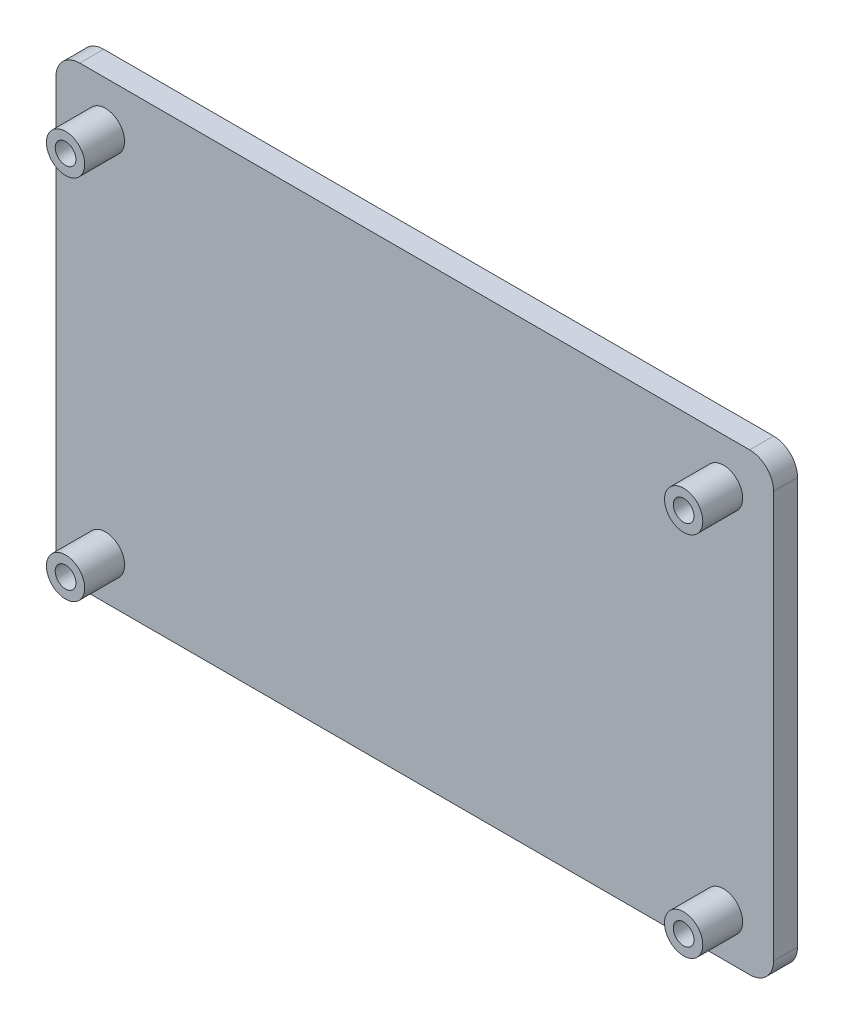
ISO-10303-21;
HEADER;
FILE_DESCRIPTION(('STEP AP214'),'2;1');
FILE_NAME('part.step','',(''),(''),'','','');
FILE_SCHEMA(('AUTOMOTIVE_DESIGN { 1 0 10303 214 1 1 1 1 }'));
ENDSEC;
DATA;
#1=APPLICATION_CONTEXT('core data for automotive mechanical design processes');
#2=APPLICATION_PROTOCOL_DEFINITION('international standard','automotive_design',2000,#1);
#3=PRODUCT_CONTEXT('',#1,'mechanical');
#4=PRODUCT('Part','Part','',(#3));
#5=PRODUCT_RELATED_PRODUCT_CATEGORY('part','',(#4));
#6=PRODUCT_DEFINITION_FORMATION('','',#4);
#7=PRODUCT_DEFINITION_CONTEXT('part definition',#1,'design');
#8=PRODUCT_DEFINITION('design','',#6,#7);
#9=PRODUCT_DEFINITION_SHAPE('','',#8);
#10=(LENGTH_UNIT() NAMED_UNIT(*) SI_UNIT(.MILLI.,.METRE.));
#11=(NAMED_UNIT(*) PLANE_ANGLE_UNIT() SI_UNIT($,.RADIAN.));
#12=(NAMED_UNIT(*) SI_UNIT($,.STERADIAN.) SOLID_ANGLE_UNIT());
#13=UNCERTAINTY_MEASURE_WITH_UNIT(LENGTH_MEASURE(1.E-05),#10,'distance_accuracy_value','');
#14=(GEOMETRIC_REPRESENTATION_CONTEXT(3) GLOBAL_UNCERTAINTY_ASSIGNED_CONTEXT((#13)) GLOBAL_UNIT_ASSIGNED_CONTEXT((#10,
#11,#12)) REPRESENTATION_CONTEXT('',''));
#15=CARTESIAN_POINT('',(0.,0.,0.));
#16=DIRECTION('',(0.,0.,1.));
#17=DIRECTION('',(1.,0.,0.));
#18=AXIS2_PLACEMENT_3D('',#15,#16,#17);
#19=CARTESIAN_POINT('',(0.,0.,0.));
#20=DIRECTION('',(0.,0.,1.));
#21=DIRECTION('',(1.,0.,0.));
#22=AXIS2_PLACEMENT_3D('',#19,#20,#21);
#23=PLANE('',#22);
#24=CARTESIAN_POINT('',(-43.7178545582846,-24.2969318414095,0.));
#25=DIRECTION('',(0.,0.,1.));
#26=DIRECTION('',(1.,0.,0.));
#27=AXIS2_PLACEMENT_3D('',#24,#25,#26);
#28=CIRCLE('',#27,3.);
#29=CARTESIAN_POINT('',(-43.7178545582846,-27.2969318414095,0.));
#30=VERTEX_POINT('',#29);
#31=CARTESIAN_POINT('',(-46.7178545582846,-24.2969318414095,0.));
#32=VERTEX_POINT('',#31);
#33=EDGE_CURVE('E395',#30,#32,#28,.F.);
#34=ORIENTED_EDGE('',*,*,#33,.F.);
#35=DIRECTION('',(1.,0.,0.));
#36=VECTOR('',#35,1.);
#37=CARTESIAN_POINT('',(0.,-27.2969318414095,0.));
#38=LINE('',#37,#36);
#39=CARTESIAN_POINT('',(40.2821454417154,-27.2969318414095,0.));
#40=VERTEX_POINT('',#39);
#41=EDGE_CURVE('E398',#30,#40,#38,.T.);
#42=ORIENTED_EDGE('',*,*,#41,.T.);
#43=CARTESIAN_POINT('',(40.2821454417154,-24.2969318414095,0.));
#44=DIRECTION('',(0.,0.,1.));
#45=DIRECTION('',(1.,0.,0.));
#46=AXIS2_PLACEMENT_3D('',#43,#44,#45);
#47=CIRCLE('',#46,3.);
#48=CARTESIAN_POINT('',(43.2821454417154,-24.2969318414095,0.));
#49=VERTEX_POINT('',#48);
#50=EDGE_CURVE('E403',#49,#40,#47,.F.);
#51=ORIENTED_EDGE('',*,*,#50,.F.);
#52=DIRECTION('',(0.,-1.,0.));
#53=VECTOR('',#52,1.);
#54=CARTESIAN_POINT('',(43.2821454417154,0.,0.));
#55=LINE('',#54,#53);
#56=CARTESIAN_POINT('',(43.2821454417154,26.7030681585905,0.));
#57=VERTEX_POINT('',#56);
#58=EDGE_CURVE('E407',#57,#49,#55,.T.);
#59=ORIENTED_EDGE('',*,*,#58,.F.);
#60=CARTESIAN_POINT('',(40.2821454417154,26.7030681585905,0.));
#61=DIRECTION('',(0.,0.,1.));
#62=DIRECTION('',(1.,0.,0.));
#63=AXIS2_PLACEMENT_3D('',#60,#61,#62);
#64=CIRCLE('',#63,3.00000000000001);
#65=CARTESIAN_POINT('',(40.2821454417154,29.7030681585905,0.));
#66=VERTEX_POINT('',#65);
#67=EDGE_CURVE('E410',#57,#66,#64,.T.);
#68=ORIENTED_EDGE('',*,*,#67,.T.);
#69=DIRECTION('',(1.,0.,0.));
#70=VECTOR('',#69,1.);
#71=CARTESIAN_POINT('',(0.,29.7030681585905,0.));
#72=LINE('',#71,#70);
#73=CARTESIAN_POINT('',(-43.7178545582846,29.7030681585905,0.));
#74=VERTEX_POINT('',#73);
#75=EDGE_CURVE('E414',#74,#66,#72,.T.);
#76=ORIENTED_EDGE('',*,*,#75,.F.);
#77=CARTESIAN_POINT('',(-43.7178545582846,26.7030681585905,0.));
#78=DIRECTION('',(0.,0.,1.));
#79=DIRECTION('',(1.,0.,0.));
#80=AXIS2_PLACEMENT_3D('',#77,#78,#79);
#81=CIRCLE('',#80,3.);
#82=CARTESIAN_POINT('',(-46.7178545582846,26.7030681585905,0.));
#83=VERTEX_POINT('',#82);
#84=EDGE_CURVE('E376',#83,#74,#81,.F.);
#85=ORIENTED_EDGE('',*,*,#84,.F.);
#86=DIRECTION('',(0.,-1.,0.));
#87=VECTOR('',#86,1.);
#88=CARTESIAN_POINT('',(-46.7178545582846,0.,0.));
#89=LINE('',#88,#87);
#90=EDGE_CURVE('E419',#83,#32,#89,.T.);
#91=ORIENTED_EDGE('',*,*,#90,.T.);
#92=EDGE_LOOP('',(#34,#42,#51,#59,#68,#76,#85,#91));
#93=FACE_BOUND('',#92,.T.);
#94=CARTESIAN_POINT('',(-40.5,24.,0.));
#95=DIRECTION('',(0.,0.,1.));
#96=DIRECTION('',(1.,0.,0.));
#97=AXIS2_PLACEMENT_3D('',#94,#95,#96);
#98=CIRCLE('',#97,2.4);
#99=CARTESIAN_POINT('',(-38.1,24.,0.));
#100=VERTEX_POINT('',#99);
#101=EDGE_CURVE('E291',#100,#100,#98,.T.);
#102=ORIENTED_EDGE('',*,*,#101,.F.);
#103=EDGE_LOOP('',(#102));
#104=FACE_BOUND('',#103,.T.);
#105=CARTESIAN_POINT('',(37.,24.,0.));
#106=DIRECTION('',(0.,0.,1.));
#107=DIRECTION('',(1.,0.,0.));
#108=AXIS2_PLACEMENT_3D('',#105,#106,#107);
#109=CIRCLE('',#108,2.4);
#110=CARTESIAN_POINT('',(39.4,24.,0.));
#111=VERTEX_POINT('',#110);
#112=EDGE_CURVE('E474',#111,#111,#109,.T.);
#113=ORIENTED_EDGE('',*,*,#112,.F.);
#114=EDGE_LOOP('',(#113));
#115=FACE_BOUND('',#114,.T.);
#116=CARTESIAN_POINT('',(37.,-22.,0.));
#117=DIRECTION('',(0.,0.,1.));
#118=DIRECTION('',(1.,0.,0.));
#119=AXIS2_PLACEMENT_3D('',#116,#117,#118);
#120=CIRCLE('',#119,2.4);
#121=CARTESIAN_POINT('',(39.4,-22.,0.));
#122=VERTEX_POINT('',#121);
#123=EDGE_CURVE('E478',#122,#122,#120,.T.);
#124=ORIENTED_EDGE('',*,*,#123,.F.);
#125=EDGE_LOOP('',(#124));
#126=FACE_BOUND('',#125,.T.);
#127=CARTESIAN_POINT('',(-40.5,-22.,0.));
#128=DIRECTION('',(0.,0.,1.));
#129=DIRECTION('',(1.,0.,0.));
#130=AXIS2_PLACEMENT_3D('',#127,#128,#129);
#131=CIRCLE('',#130,2.4);
#132=CARTESIAN_POINT('',(-38.1,-22.,0.));
#133=VERTEX_POINT('',#132);
#134=EDGE_CURVE('E481',#133,#133,#131,.T.);
#135=ORIENTED_EDGE('',*,*,#134,.F.);
#136=EDGE_LOOP('',(#135));
#137=FACE_BOUND('',#136,.T.);
#138=ADVANCED_FACE('F287',(#93,#104,#115,#126,#137),#23,.T.);
#139=CARTESIAN_POINT('',(-40.5,24.,5.00040978854401));
#140=DIRECTION('',(0.,0.,-1.));
#141=DIRECTION('',(-1.,0.,0.));
#142=AXIS2_PLACEMENT_3D('',#139,#140,#141);
#143=CYLINDRICAL_SURFACE('',#142,1.3);
#144=CARTESIAN_POINT('',(-40.5,24.,5.00040978854401));
#145=DIRECTION('',(0.,0.,1.));
#146=DIRECTION('',(1.,0.,0.));
#147=AXIS2_PLACEMENT_3D('',#144,#145,#146);
#148=CIRCLE('',#147,1.3);
#149=CARTESIAN_POINT('',(-39.2,24.,5.00040978854401));
#150=VERTEX_POINT('',#149);
#151=EDGE_CURVE('E298',#150,#150,#148,.T.);
#152=ORIENTED_EDGE('',*,*,#151,.T.);
#153=EDGE_LOOP('',(#152));
#154=FACE_BOUND('',#153,.T.);
#155=CARTESIAN_POINT('',(-40.5,24.,-3.));
#156=DIRECTION('',(0.,0.,1.));
#157=DIRECTION('',(1.,0.,0.));
#158=AXIS2_PLACEMENT_3D('',#155,#156,#157);
#159=CIRCLE('',#158,1.3);
#160=CARTESIAN_POINT('',(-39.2,24.,-3.));
#161=VERTEX_POINT('',#160);
#162=EDGE_CURVE('E399',#161,#161,#159,.T.);
#163=ORIENTED_EDGE('',*,*,#162,.F.);
#164=EDGE_LOOP('',(#163));
#165=FACE_BOUND('',#164,.T.);
#166=ADVANCED_FACE('F289',(#154,#165),#143,.F.);
#167=CARTESIAN_POINT('',(-40.5,24.,5.00040978854401));
#168=DIRECTION('',(0.,0.,-1.));
#169=DIRECTION('',(-1.,0.,0.));
#170=AXIS2_PLACEMENT_3D('',#167,#168,#169);
#171=CYLINDRICAL_SURFACE('',#170,2.4);
#172=CARTESIAN_POINT('',(-40.5,24.,5.00040978854401));
#173=DIRECTION('',(0.,0.,1.));
#174=DIRECTION('',(1.,0.,0.));
#175=AXIS2_PLACEMENT_3D('',#172,#173,#174);
#176=CIRCLE('',#175,2.4);
#177=CARTESIAN_POINT('',(-38.1,24.,5.00040978854401));
#178=VERTEX_POINT('',#177);
#179=EDGE_CURVE('E12',#178,#178,#176,.T.);
#180=ORIENTED_EDGE('',*,*,#179,.F.);
#181=EDGE_LOOP('',(#180));
#182=FACE_BOUND('',#181,.T.);
#183=ORIENTED_EDGE('',*,*,#101,.T.);
#184=EDGE_LOOP('',(#183));
#185=FACE_BOUND('',#184,.T.);
#186=ADVANCED_FACE('F465',(#182,#185),#171,.T.);
#187=CARTESIAN_POINT('',(0.,0.,5.00040978854401));
#188=DIRECTION('',(0.,0.,1.));
#189=DIRECTION('',(1.,0.,0.));
#190=AXIS2_PLACEMENT_3D('',#187,#188,#189);
#191=PLANE('',#190);
#192=ORIENTED_EDGE('',*,*,#151,.F.);
#193=EDGE_LOOP('',(#192));
#194=FACE_BOUND('',#193,.T.);
#195=ORIENTED_EDGE('',*,*,#179,.T.);
#196=EDGE_LOOP('',(#195));
#197=FACE_BOUND('',#196,.T.);
#198=ADVANCED_FACE('F558',(#194,#197),#191,.T.);
#199=CARTESIAN_POINT('',(-46.7178545582846,0.,-3.));
#200=DIRECTION('',(-1.,0.,0.));
#201=DIRECTION('',(0.,-1.,0.));
#202=AXIS2_PLACEMENT_3D('',#199,#200,#201);
#203=PLANE('',#202);
#204=ORIENTED_EDGE('',*,*,#90,.F.);
#205=DIRECTION('',(0.,0.,1.));
#206=VECTOR('',#205,1.);
#207=CARTESIAN_POINT('',(-46.7178545582846,26.7030681585905,-3.));
#208=LINE('',#207,#206);
#209=CARTESIAN_POINT('',(-46.7178545582846,26.7030681585905,-3.));
#210=VERTEX_POINT('',#209);
#211=EDGE_CURVE('E334',#210,#83,#208,.T.);
#212=ORIENTED_EDGE('',*,*,#211,.F.);
#213=DIRECTION('',(0.,-1.,0.));
#214=VECTOR('',#213,1.);
#215=CARTESIAN_POINT('',(-46.7178545582846,0.,-3.));
#216=LINE('',#215,#214);
#217=CARTESIAN_POINT('',(-46.7178545582846,-24.2969318414095,-3.));
#218=VERTEX_POINT('',#217);
#219=EDGE_CURVE('E370',#210,#218,#216,.T.);
#220=ORIENTED_EDGE('',*,*,#219,.T.);
#221=DIRECTION('',(0.,0.,1.));
#222=VECTOR('',#221,1.);
#223=CARTESIAN_POINT('',(-46.7178545582846,-24.2969318414095,-3.));
#224=LINE('',#223,#222);
#225=EDGE_CURVE('E341',#218,#32,#224,.T.);
#226=ORIENTED_EDGE('',*,*,#225,.T.);
#227=EDGE_LOOP('',(#204,#212,#220,#226));
#228=FACE_BOUND('',#227,.T.);
#229=ADVANCED_FACE('F557',(#228),#203,.T.);
#230=CARTESIAN_POINT('',(-43.7178545582846,26.7030681585905,-3.));
#231=DIRECTION('',(0.,0.,1.));
#232=DIRECTION('',(1.,0.,0.));
#233=AXIS2_PLACEMENT_3D('',#230,#231,#232);
#234=CYLINDRICAL_SURFACE('',#233,3.);
#235=ORIENTED_EDGE('',*,*,#84,.T.);
#236=DIRECTION('',(0.,0.,1.));
#237=VECTOR('',#236,1.);
#238=CARTESIAN_POINT('',(-43.7178545582846,29.7030681585905,-3.));
#239=LINE('',#238,#237);
#240=CARTESIAN_POINT('',(-43.7178545582846,29.7030681585905,-3.));
#241=VERTEX_POINT('',#240);
#242=EDGE_CURVE('E374',#241,#74,#239,.T.);
#243=ORIENTED_EDGE('',*,*,#242,.F.);
#244=CARTESIAN_POINT('',(-43.7178545582846,26.7030681585905,-3.));
#245=DIRECTION('',(0.,0.,1.));
#246=DIRECTION('',(1.,0.,0.));
#247=AXIS2_PLACEMENT_3D('',#244,#245,#246);
#248=CIRCLE('',#247,3.);
#249=EDGE_CURVE('E362',#210,#241,#248,.F.);
#250=ORIENTED_EDGE('',*,*,#249,.F.);
#251=ORIENTED_EDGE('',*,*,#211,.T.);
#252=EDGE_LOOP('',(#235,#243,#250,#251));
#253=FACE_BOUND('',#252,.T.);
#254=ADVANCED_FACE('F375',(#253),#234,.T.);
#255=CARTESIAN_POINT('',(0.,29.7030681585905,-3.));
#256=DIRECTION('',(0.,-1.,0.));
#257=DIRECTION('',(1.,0.,0.));
#258=AXIS2_PLACEMENT_3D('',#255,#256,#257);
#259=PLANE('',#258);
#260=ORIENTED_EDGE('',*,*,#75,.T.);
#261=DIRECTION('',(0.,0.,1.));
#262=VECTOR('',#261,1.);
#263=CARTESIAN_POINT('',(40.2821454417154,29.7030681585905,-3.));
#264=LINE('',#263,#262);
#265=CARTESIAN_POINT('',(40.2821454417154,29.7030681585905,-3.));
#266=VERTEX_POINT('',#265);
#267=EDGE_CURVE('E381',#266,#66,#264,.T.);
#268=ORIENTED_EDGE('',*,*,#267,.F.);
#269=DIRECTION('',(1.,0.,0.));
#270=VECTOR('',#269,1.);
#271=CARTESIAN_POINT('',(0.,29.7030681585905,-3.));
#272=LINE('',#271,#270);
#273=EDGE_CURVE('E368',#241,#266,#272,.T.);
#274=ORIENTED_EDGE('',*,*,#273,.F.);
#275=ORIENTED_EDGE('',*,*,#242,.T.);
#276=EDGE_LOOP('',(#260,#268,#274,#275));
#277=FACE_BOUND('',#276,.T.);
#278=ADVANCED_FACE('F383',(#277),#259,.F.);
#279=CARTESIAN_POINT('',(40.2821454417154,26.7030681585905,-3.));
#280=DIRECTION('',(0.,0.,1.));
#281=DIRECTION('',(1.,0.,0.));
#282=AXIS2_PLACEMENT_3D('',#279,#280,#281);
#283=CYLINDRICAL_SURFACE('',#282,3.00000000000001);
#284=ORIENTED_EDGE('',*,*,#67,.F.);
#285=DIRECTION('',(0.,0.,1.));
#286=VECTOR('',#285,1.);
#287=CARTESIAN_POINT('',(43.2821454417154,26.7030681585905,-3.));
#288=LINE('',#287,#286);
#289=CARTESIAN_POINT('',(43.2821454417154,26.7030681585905,-3.));
#290=VERTEX_POINT('',#289);
#291=EDGE_CURVE('E429',#290,#57,#288,.T.);
#292=ORIENTED_EDGE('',*,*,#291,.F.);
#293=CARTESIAN_POINT('',(40.2821454417154,26.7030681585905,-3.));
#294=DIRECTION('',(0.,0.,1.));
#295=DIRECTION('',(1.,0.,0.));
#296=AXIS2_PLACEMENT_3D('',#293,#294,#295);
#297=CIRCLE('',#296,3.00000000000001);
#298=EDGE_CURVE('E386',#290,#266,#297,.T.);
#299=ORIENTED_EDGE('',*,*,#298,.T.);
#300=ORIENTED_EDGE('',*,*,#267,.T.);
#301=EDGE_LOOP('',(#284,#292,#299,#300));
#302=FACE_BOUND('',#301,.T.);
#303=ADVANCED_FACE('F612',(#302),#283,.T.);
#304=CARTESIAN_POINT('',(43.2821454417154,0.,-3.));
#305=DIRECTION('',(-1.,0.,0.));
#306=DIRECTION('',(0.,-1.,0.));
#307=AXIS2_PLACEMENT_3D('',#304,#305,#306);
#308=PLANE('',#307);
#309=ORIENTED_EDGE('',*,*,#58,.T.);
#310=DIRECTION('',(0.,0.,1.));
#311=VECTOR('',#310,1.);
#312=CARTESIAN_POINT('',(43.2821454417154,-24.2969318414095,-3.));
#313=LINE('',#312,#311);
#314=CARTESIAN_POINT('',(43.2821454417154,-24.2969318414095,-3.));
#315=VERTEX_POINT('',#314);
#316=EDGE_CURVE('E432',#315,#49,#313,.T.);
#317=ORIENTED_EDGE('',*,*,#316,.F.);
#318=DIRECTION('',(0.,-1.,0.));
#319=VECTOR('',#318,1.);
#320=CARTESIAN_POINT('',(43.2821454417154,0.,-3.));
#321=LINE('',#320,#319);
#322=EDGE_CURVE('E389',#290,#315,#321,.T.);
#323=ORIENTED_EDGE('',*,*,#322,.F.);
#324=ORIENTED_EDGE('',*,*,#291,.T.);
#325=EDGE_LOOP('',(#309,#317,#323,#324));
#326=FACE_BOUND('',#325,.T.);
#327=ADVANCED_FACE('F526',(#326),#308,.F.);
#328=CARTESIAN_POINT('',(40.2821454417154,-24.2969318414095,-3.));
#329=DIRECTION('',(0.,0.,1.));
#330=DIRECTION('',(1.,0.,0.));
#331=AXIS2_PLACEMENT_3D('',#328,#329,#330);
#332=CYLINDRICAL_SURFACE('',#331,3.);
#333=ORIENTED_EDGE('',*,*,#50,.T.);
#334=DIRECTION('',(0.,0.,1.));
#335=VECTOR('',#334,1.);
#336=CARTESIAN_POINT('',(40.2821454417154,-27.2969318414095,-3.));
#337=LINE('',#336,#335);
#338=CARTESIAN_POINT('',(40.2821454417154,-27.2969318414095,-3.));
#339=VERTEX_POINT('',#338);
#340=EDGE_CURVE('E436',#339,#40,#337,.T.);
#341=ORIENTED_EDGE('',*,*,#340,.F.);
#342=CARTESIAN_POINT('',(40.2821454417154,-24.2969318414095,-3.));
#343=DIRECTION('',(0.,0.,1.));
#344=DIRECTION('',(1.,0.,0.));
#345=AXIS2_PLACEMENT_3D('',#342,#343,#344);
#346=CIRCLE('',#345,3.);
#347=EDGE_CURVE('E518',#315,#339,#346,.F.);
#348=ORIENTED_EDGE('',*,*,#347,.F.);
#349=ORIENTED_EDGE('',*,*,#316,.T.);
#350=EDGE_LOOP('',(#333,#341,#348,#349));
#351=FACE_BOUND('',#350,.T.);
#352=ADVANCED_FACE('F530',(#351),#332,.T.);
#353=CARTESIAN_POINT('',(0.,-27.2969318414095,-3.));
#354=DIRECTION('',(0.,-1.,0.));
#355=DIRECTION('',(1.,0.,0.));
#356=AXIS2_PLACEMENT_3D('',#353,#354,#355);
#357=PLANE('',#356);
#358=ORIENTED_EDGE('',*,*,#41,.F.);
#359=DIRECTION('',(0.,0.,1.));
#360=VECTOR('',#359,1.);
#361=CARTESIAN_POINT('',(-43.7178545582846,-27.2969318414095,-3.));
#362=LINE('',#361,#360);
#363=CARTESIAN_POINT('',(-43.7178545582846,-27.2969318414095,-3.));
#364=VERTEX_POINT('',#363);
#365=EDGE_CURVE('E349',#364,#30,#362,.T.);
#366=ORIENTED_EDGE('',*,*,#365,.F.);
#367=DIRECTION('',(1.,0.,0.));
#368=VECTOR('',#367,1.);
#369=CARTESIAN_POINT('',(0.,-27.2969318414095,-3.));
#370=LINE('',#369,#368);
#371=EDGE_CURVE('E515',#364,#339,#370,.T.);
#372=ORIENTED_EDGE('',*,*,#371,.T.);
#373=ORIENTED_EDGE('',*,*,#340,.T.);
#374=EDGE_LOOP('',(#358,#366,#372,#373));
#375=FACE_BOUND('',#374,.T.);
#376=ADVANCED_FACE('F531',(#375),#357,.T.);
#377=CARTESIAN_POINT('',(-43.7178545582846,-24.2969318414095,-3.));
#378=DIRECTION('',(0.,0.,1.));
#379=DIRECTION('',(1.,0.,0.));
#380=AXIS2_PLACEMENT_3D('',#377,#378,#379);
#381=CYLINDRICAL_SURFACE('',#380,3.);
#382=ORIENTED_EDGE('',*,*,#33,.T.);
#383=ORIENTED_EDGE('',*,*,#225,.F.);
#384=CARTESIAN_POINT('',(-43.7178545582846,-24.2969318414095,-3.));
#385=DIRECTION('',(0.,0.,1.));
#386=DIRECTION('',(1.,0.,0.));
#387=AXIS2_PLACEMENT_3D('',#384,#385,#386);
#388=CIRCLE('',#387,3.);
#389=EDGE_CURVE('E306',#364,#218,#388,.F.);
#390=ORIENTED_EDGE('',*,*,#389,.F.);
#391=ORIENTED_EDGE('',*,*,#365,.T.);
#392=EDGE_LOOP('',(#382,#383,#390,#391));
#393=FACE_BOUND('',#392,.T.);
#394=ADVANCED_FACE('F533',(#393),#381,.T.);
#395=CARTESIAN_POINT('',(0.,0.,-3.));
#396=DIRECTION('',(0.,0.,1.));
#397=DIRECTION('',(1.,0.,0.));
#398=AXIS2_PLACEMENT_3D('',#395,#396,#397);
#399=PLANE('',#398);
#400=ORIENTED_EDGE('',*,*,#389,.T.);
#401=ORIENTED_EDGE('',*,*,#219,.F.);
#402=ORIENTED_EDGE('',*,*,#249,.T.);
#403=ORIENTED_EDGE('',*,*,#273,.T.);
#404=ORIENTED_EDGE('',*,*,#298,.F.);
#405=ORIENTED_EDGE('',*,*,#322,.T.);
#406=ORIENTED_EDGE('',*,*,#347,.T.);
#407=ORIENTED_EDGE('',*,*,#371,.F.);
#408=EDGE_LOOP('',(#400,#401,#402,#403,#404,#405,#406,#407));
#409=FACE_BOUND('',#408,.T.);
#410=CARTESIAN_POINT('',(37.,24.,-3.));
#411=DIRECTION('',(0.,0.,1.));
#412=DIRECTION('',(1.,0.,0.));
#413=AXIS2_PLACEMENT_3D('',#410,#411,#412);
#414=CIRCLE('',#413,1.3);
#415=CARTESIAN_POINT('',(38.3,24.,-3.));
#416=VERTEX_POINT('',#415);
#417=EDGE_CURVE('E448',#416,#416,#414,.T.);
#418=ORIENTED_EDGE('',*,*,#417,.T.);
#419=EDGE_LOOP('',(#418));
#420=FACE_BOUND('',#419,.T.);
#421=CARTESIAN_POINT('',(37.,-22.,-3.));
#422=DIRECTION('',(0.,0.,1.));
#423=DIRECTION('',(1.,0.,0.));
#424=AXIS2_PLACEMENT_3D('',#421,#422,#423);
#425=CIRCLE('',#424,1.3);
#426=CARTESIAN_POINT('',(38.3,-22.,-3.));
#427=VERTEX_POINT('',#426);
#428=EDGE_CURVE('E452',#427,#427,#425,.T.);
#429=ORIENTED_EDGE('',*,*,#428,.T.);
#430=EDGE_LOOP('',(#429));
#431=FACE_BOUND('',#430,.T.);
#432=ORIENTED_EDGE('',*,*,#162,.T.);
#433=EDGE_LOOP('',(#432));
#434=FACE_BOUND('',#433,.T.);
#435=CARTESIAN_POINT('',(-40.5,-22.,-3.));
#436=DIRECTION('',(0.,0.,1.));
#437=DIRECTION('',(1.,0.,0.));
#438=AXIS2_PLACEMENT_3D('',#435,#436,#437);
#439=CIRCLE('',#438,1.3);
#440=CARTESIAN_POINT('',(-39.2,-22.,-3.));
#441=VERTEX_POINT('',#440);
#442=EDGE_CURVE('E444',#441,#441,#439,.T.);
#443=ORIENTED_EDGE('',*,*,#442,.T.);
#444=EDGE_LOOP('',(#443));
#445=FACE_BOUND('',#444,.T.);
#446=ADVANCED_FACE('F364',(#409,#420,#431,#434,#445),#399,.F.);
#447=CARTESIAN_POINT('',(37.,-22.,-3.));
#448=DIRECTION('',(0.,0.,1.));
#449=DIRECTION('',(1.,0.,0.));
#450=AXIS2_PLACEMENT_3D('',#447,#448,#449);
#451=CYLINDRICAL_SURFACE('',#450,1.3);
#452=ORIENTED_EDGE('',*,*,#428,.F.);
#453=EDGE_LOOP('',(#452));
#454=FACE_BOUND('',#453,.T.);
#455=CARTESIAN_POINT('',(37.,-22.,5.));
#456=DIRECTION('',(0.,0.,1.));
#457=DIRECTION('',(1.,0.,0.));
#458=AXIS2_PLACEMENT_3D('',#455,#456,#457);
#459=CIRCLE('',#458,1.3);
#460=CARTESIAN_POINT('',(38.3,-22.,5.));
#461=VERTEX_POINT('',#460);
#462=EDGE_CURVE('E494',#461,#461,#459,.T.);
#463=ORIENTED_EDGE('',*,*,#462,.T.);
#464=EDGE_LOOP('',(#463));
#465=FACE_BOUND('',#464,.T.);
#466=ADVANCED_FACE('F552',(#454,#465),#451,.F.);
#467=CARTESIAN_POINT('',(37.,24.,-3.));
#468=DIRECTION('',(0.,0.,1.));
#469=DIRECTION('',(1.,0.,0.));
#470=AXIS2_PLACEMENT_3D('',#467,#468,#469);
#471=CYLINDRICAL_SURFACE('',#470,1.3);
#472=ORIENTED_EDGE('',*,*,#417,.F.);
#473=EDGE_LOOP('',(#472));
#474=FACE_BOUND('',#473,.T.);
#475=CARTESIAN_POINT('',(37.,24.,5.));
#476=DIRECTION('',(0.,0.,1.));
#477=DIRECTION('',(1.,0.,0.));
#478=AXIS2_PLACEMENT_3D('',#475,#476,#477);
#479=CIRCLE('',#478,1.3);
#480=CARTESIAN_POINT('',(38.3,24.,5.));
#481=VERTEX_POINT('',#480);
#482=EDGE_CURVE('E504',#481,#481,#479,.T.);
#483=ORIENTED_EDGE('',*,*,#482,.T.);
#484=EDGE_LOOP('',(#483));
#485=FACE_BOUND('',#484,.T.);
#486=ADVANCED_FACE('F548',(#474,#485),#471,.F.);
#487=CARTESIAN_POINT('',(-40.5,-22.,-3.));
#488=DIRECTION('',(0.,0.,1.));
#489=DIRECTION('',(1.,0.,0.));
#490=AXIS2_PLACEMENT_3D('',#487,#488,#489);
#491=CYLINDRICAL_SURFACE('',#490,1.3);
#492=ORIENTED_EDGE('',*,*,#442,.F.);
#493=EDGE_LOOP('',(#492));
#494=FACE_BOUND('',#493,.T.);
#495=CARTESIAN_POINT('',(-40.5,-22.,5.));
#496=DIRECTION('',(0.,0.,1.));
#497=DIRECTION('',(1.,0.,0.));
#498=AXIS2_PLACEMENT_3D('',#495,#496,#497);
#499=CIRCLE('',#498,1.3);
#500=CARTESIAN_POINT('',(-39.2,-22.,5.));
#501=VERTEX_POINT('',#500);
#502=EDGE_CURVE('E485',#501,#501,#499,.T.);
#503=ORIENTED_EDGE('',*,*,#502,.T.);
#504=EDGE_LOOP('',(#503));
#505=FACE_BOUND('',#504,.T.);
#506=ADVANCED_FACE('F544',(#494,#505),#491,.F.);
#507=CARTESIAN_POINT('',(37.,24.,5.));
#508=DIRECTION('',(0.,0.,-1.));
#509=DIRECTION('',(-1.,0.,0.));
#510=AXIS2_PLACEMENT_3D('',#507,#508,#509);
#511=CYLINDRICAL_SURFACE('',#510,2.4);
#512=CARTESIAN_POINT('',(37.,24.,5.));
#513=DIRECTION('',(0.,0.,1.));
#514=DIRECTION('',(1.,0.,0.));
#515=AXIS2_PLACEMENT_3D('',#512,#513,#514);
#516=CIRCLE('',#515,2.4);
#517=CARTESIAN_POINT('',(39.4,24.,5.));
#518=VERTEX_POINT('',#517);
#519=EDGE_CURVE('E456',#518,#518,#516,.T.);
#520=ORIENTED_EDGE('',*,*,#519,.F.);
#521=EDGE_LOOP('',(#520));
#522=FACE_BOUND('',#521,.T.);
#523=ORIENTED_EDGE('',*,*,#112,.T.);
#524=EDGE_LOOP('',(#523));
#525=FACE_BOUND('',#524,.T.);
#526=ADVANCED_FACE('F547',(#522,#525),#511,.T.);
#527=CARTESIAN_POINT('',(0.,0.,5.));
#528=DIRECTION('',(0.,0.,1.));
#529=DIRECTION('',(1.,0.,0.));
#530=AXIS2_PLACEMENT_3D('',#527,#528,#529);
#531=PLANE('',#530);
#532=ORIENTED_EDGE('',*,*,#482,.F.);
#533=EDGE_LOOP('',(#532));
#534=FACE_BOUND('',#533,.T.);
#535=ORIENTED_EDGE('',*,*,#519,.T.);
#536=EDGE_LOOP('',(#535));
#537=FACE_BOUND('',#536,.T.);
#538=ADVANCED_FACE('F598',(#534,#537),#531,.T.);
#539=CARTESIAN_POINT('',(37.,-22.,5.));
#540=DIRECTION('',(0.,0.,-1.));
#541=DIRECTION('',(-1.,0.,0.));
#542=AXIS2_PLACEMENT_3D('',#539,#540,#541);
#543=CYLINDRICAL_SURFACE('',#542,2.4);
#544=CARTESIAN_POINT('',(37.,-22.,5.));
#545=DIRECTION('',(0.,0.,1.));
#546=DIRECTION('',(1.,0.,0.));
#547=AXIS2_PLACEMENT_3D('',#544,#545,#546);
#548=CIRCLE('',#547,2.4);
#549=CARTESIAN_POINT('',(39.4,-22.,5.));
#550=VERTEX_POINT('',#549);
#551=EDGE_CURVE('E498',#550,#550,#548,.T.);
#552=ORIENTED_EDGE('',*,*,#551,.F.);
#553=EDGE_LOOP('',(#552));
#554=FACE_BOUND('',#553,.T.);
#555=ORIENTED_EDGE('',*,*,#123,.T.);
#556=EDGE_LOOP('',(#555));
#557=FACE_BOUND('',#556,.T.);
#558=ADVANCED_FACE('F592',(#554,#557),#543,.T.);
#559=CARTESIAN_POINT('',(0.,0.,5.));
#560=DIRECTION('',(0.,0.,1.));
#561=DIRECTION('',(1.,0.,0.));
#562=AXIS2_PLACEMENT_3D('',#559,#560,#561);
#563=PLANE('',#562);
#564=ORIENTED_EDGE('',*,*,#462,.F.);
#565=EDGE_LOOP('',(#564));
#566=FACE_BOUND('',#565,.T.);
#567=ORIENTED_EDGE('',*,*,#551,.T.);
#568=EDGE_LOOP('',(#567));
#569=FACE_BOUND('',#568,.T.);
#570=ADVANCED_FACE('F583',(#566,#569),#563,.T.);
#571=CARTESIAN_POINT('',(-40.5,-22.,5.));
#572=DIRECTION('',(0.,0.,1.));
#573=DIRECTION('',(1.,0.,0.));
#574=AXIS2_PLACEMENT_3D('',#571,#572,#573);
#575=PLANE('',#574);
#576=CARTESIAN_POINT('',(-40.5,-22.,5.));
#577=DIRECTION('',(0.,0.,1.));
#578=DIRECTION('',(1.,0.,0.));
#579=AXIS2_PLACEMENT_3D('',#576,#577,#578);
#580=CIRCLE('',#579,2.4);
#581=CARTESIAN_POINT('',(-38.1,-22.,5.));
#582=VERTEX_POINT('',#581);
#583=EDGE_CURVE('E484',#582,#582,#580,.T.);
#584=ORIENTED_EDGE('',*,*,#583,.T.);
#585=EDGE_LOOP('',(#584));
#586=FACE_BOUND('',#585,.T.);
#587=ORIENTED_EDGE('',*,*,#502,.F.);
#588=EDGE_LOOP('',(#587));
#589=FACE_BOUND('',#588,.T.);
#590=ADVANCED_FACE('F580',(#586,#589),#575,.T.);
#591=CARTESIAN_POINT('',(-40.5,-22.,5.));
#592=DIRECTION('',(0.,0.,-1.));
#593=DIRECTION('',(-1.,0.,0.));
#594=AXIS2_PLACEMENT_3D('',#591,#592,#593);
#595=CYLINDRICAL_SURFACE('',#594,2.4);
#596=ORIENTED_EDGE('',*,*,#583,.F.);
#597=EDGE_LOOP('',(#596));
#598=FACE_BOUND('',#597,.T.);
#599=ORIENTED_EDGE('',*,*,#134,.T.);
#600=EDGE_LOOP('',(#599));
#601=FACE_BOUND('',#600,.T.);
#602=ADVANCED_FACE('F582',(#598,#601),#595,.T.);
#603=CLOSED_SHELL('',(#138,#166,#186,#198,#229,#254,#278,#303,#327,#352,#376,#394,#446,#466,
#486,#506,#526,#538,#558,#570,#590,#602));
#604=MANIFOLD_SOLID_BREP('B2',#603);
#605=ADVANCED_BREP_SHAPE_REPRESENTATION('',(#18,#604),#14);
#606=SHAPE_DEFINITION_REPRESENTATION(#9,#605);
ENDSEC;
END-ISO-10303-21;
